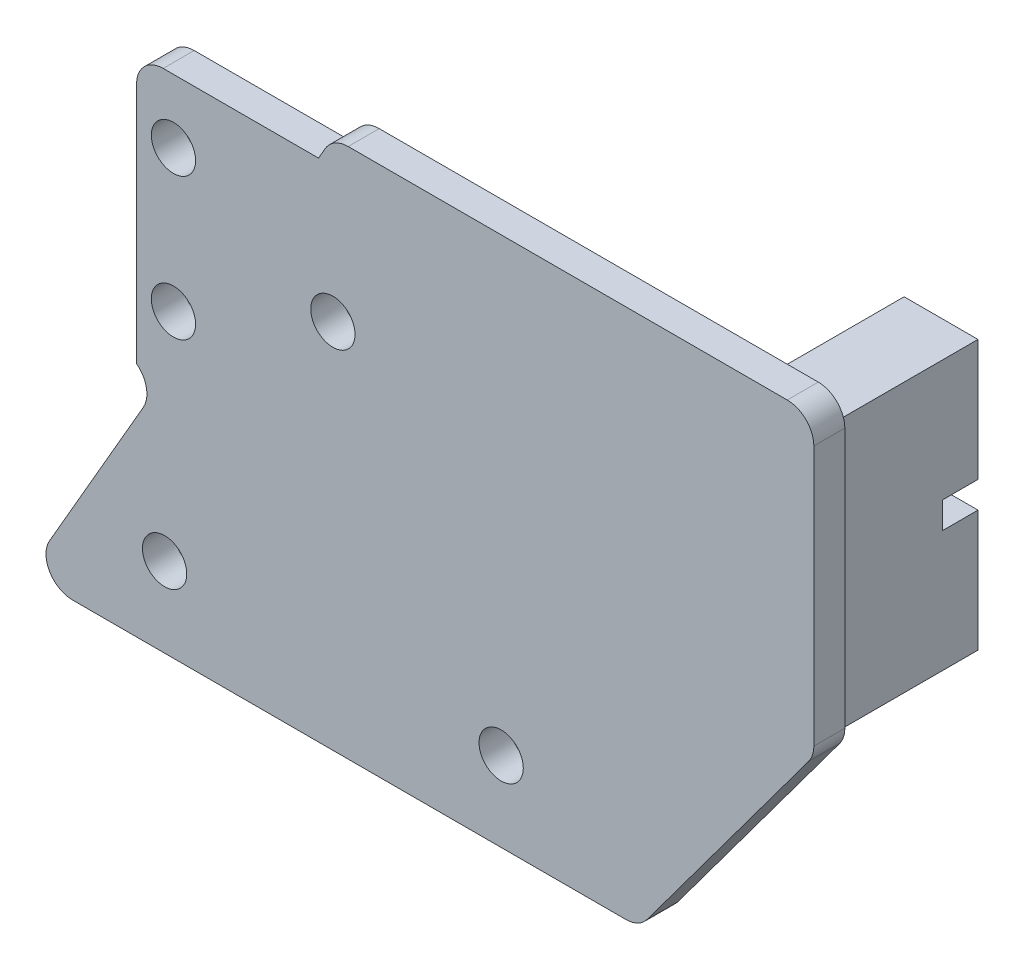
ISO-10303-21;
HEADER;
FILE_DESCRIPTION(('STEP AP214'),'2;1');
FILE_NAME('part.step','',(''),(''),'','','');
FILE_SCHEMA(('AUTOMOTIVE_DESIGN { 1 0 10303 214 1 1 1 1 }'));
ENDSEC;
DATA;
#1=APPLICATION_CONTEXT('core data for automotive mechanical design processes');
#2=APPLICATION_PROTOCOL_DEFINITION('international standard','automotive_design',2000,#1);
#3=PRODUCT_CONTEXT('',#1,'mechanical');
#4=PRODUCT('Part','Part','',(#3));
#5=PRODUCT_RELATED_PRODUCT_CATEGORY('part','',(#4));
#6=PRODUCT_DEFINITION_FORMATION('','',#4);
#7=PRODUCT_DEFINITION_CONTEXT('part definition',#1,'design');
#8=PRODUCT_DEFINITION('design','',#6,#7);
#9=PRODUCT_DEFINITION_SHAPE('','',#8);
#10=(LENGTH_UNIT() NAMED_UNIT(*) SI_UNIT(.MILLI.,.METRE.));
#11=(NAMED_UNIT(*) PLANE_ANGLE_UNIT() SI_UNIT($,.RADIAN.));
#12=(NAMED_UNIT(*) SI_UNIT($,.STERADIAN.) SOLID_ANGLE_UNIT());
#13=UNCERTAINTY_MEASURE_WITH_UNIT(LENGTH_MEASURE(1.E-05),#10,'distance_accuracy_value','');
#14=(GEOMETRIC_REPRESENTATION_CONTEXT(3) GLOBAL_UNCERTAINTY_ASSIGNED_CONTEXT((#13)) GLOBAL_UNIT_ASSIGNED_CONTEXT((#10,
#11,#12)) REPRESENTATION_CONTEXT('',''));
#15=CARTESIAN_POINT('',(0.,0.,0.));
#16=DIRECTION('',(0.,0.,1.));
#17=DIRECTION('',(1.,0.,0.));
#18=AXIS2_PLACEMENT_3D('',#15,#16,#17);
#19=CARTESIAN_POINT('',(1.83151861228162,50.9089653438087,3.5));
#20=DIRECTION('',(0.866025403784439,-0.5,0.));
#21=DIRECTION('',(0.5,0.866025403784439,0.));
#22=AXIS2_PLACEMENT_3D('',#19,#20,#21);
#23=PLANE('',#22);
#24=DIRECTION('',(0.,0.,-1.));
#25=VECTOR('',#24,1.);
#26=CARTESIAN_POINT('',(0.209745448121847,48.0999718251322,3.5));
#27=LINE('',#26,#25);
#28=CARTESIAN_POINT('',(0.209745448121847,48.0999718251322,3.5));
#29=VERTEX_POINT('',#28);
#30=CARTESIAN_POINT('',(0.209745448121847,48.0999718251322,0.));
#31=VERTEX_POINT('',#30);
#32=EDGE_CURVE('E407',#29,#31,#27,.T.);
#33=ORIENTED_EDGE('',*,*,#32,.F.);
#34=DIRECTION('',(-0.5,-0.866025403784439,0.));
#35=VECTOR('',#34,1.);
#36=CARTESIAN_POINT('',(1.83151861228162,50.9089653438087,3.5));
#37=LINE('',#36,#35);
#38=CARTESIAN_POINT('',(0.965493208497183,49.4089653438087,3.5));
#39=VERTEX_POINT('',#38);
#40=EDGE_CURVE('E353',#39,#29,#37,.T.);
#41=ORIENTED_EDGE('',*,*,#40,.F.);
#42=DIRECTION('',(0.,0.,-1.));
#43=VECTOR('',#42,1.);
#44=CARTESIAN_POINT('',(0.965493208497183,49.4089653438087,3.5));
#45=LINE('',#44,#43);
#46=CARTESIAN_POINT('',(0.965493208497183,49.4089653438087,0.));
#47=VERTEX_POINT('',#46);
#48=EDGE_CURVE('E379',#39,#47,#45,.T.);
#49=ORIENTED_EDGE('',*,*,#48,.T.);
#50=DIRECTION('',(-0.5,-0.866025403784439,0.));
#51=VECTOR('',#50,1.);
#52=CARTESIAN_POINT('',(1.83151861228162,50.9089653438087,0.));
#53=LINE('',#52,#51);
#54=EDGE_CURVE('E367',#47,#31,#53,.T.);
#55=ORIENTED_EDGE('',*,*,#54,.T.);
#56=EDGE_LOOP('',(#33,#41,#49,#55));
#57=FACE_BOUND('',#56,.T.);
#58=ADVANCED_FACE('F112',(#57),#23,.F.);
#59=CARTESIAN_POINT('',(0.,0.,3.5));
#60=DIRECTION('',(0.,0.,-1.));
#61=DIRECTION('',(-1.,0.,0.));
#62=AXIS2_PLACEMENT_3D('',#59,#60,#61);
#63=PLANE('',#62);
#64=DIRECTION('',(0.595899203511858,0.803059237699146,0.));
#65=VECTOR('',#64,1.);
#66=CARTESIAN_POINT('',(36.4199758804015,-9.,3.5));
#67=LINE('',#66,#65);
#68=CARTESIAN_POINT('',(37.3195484080362,-7.78769761053558,3.5));
#69=VERTEX_POINT('',#68);
#70=CARTESIAN_POINT('',(55.5457579816746,16.7747214698915,3.5));
#71=VERTEX_POINT('',#70);
#72=EDGE_CURVE('E359',#69,#71,#67,.T.);
#73=ORIENTED_EDGE('',*,*,#72,.T.);
#74=CARTESIAN_POINT('',(53.1365802685772,18.5624190804271,3.5));
#75=DIRECTION('',(0.,0.,-1.));
#76=DIRECTION('',(-1.,0.,0.));
#77=AXIS2_PLACEMENT_3D('',#74,#75,#76);
#78=CIRCLE('',#77,3.);
#79=CARTESIAN_POINT('',(56.1365802685772,18.5624190804271,3.5));
#80=VERTEX_POINT('',#79);
#81=EDGE_CURVE('E439',#71,#80,#78,.F.);
#82=ORIENTED_EDGE('',*,*,#81,.T.);
#83=DIRECTION('',(0.,1.,0.));
#84=VECTOR('',#83,1.);
#85=CARTESIAN_POINT('',(56.1365802685772,17.5709388377608,3.5));
#86=LINE('',#85,#84);
#87=CARTESIAN_POINT('',(56.1365802685772,47.9089653438087,3.5));
#88=VERTEX_POINT('',#87);
#89=EDGE_CURVE('E362',#80,#88,#86,.T.);
#90=ORIENTED_EDGE('',*,*,#89,.T.);
#91=CARTESIAN_POINT('',(53.1365802685772,47.9089653438087,3.5));
#92=DIRECTION('',(0.,0.,-1.));
#93=DIRECTION('',(-1.,0.,0.));
#94=AXIS2_PLACEMENT_3D('',#91,#92,#93);
#95=CIRCLE('',#94,3.);
#96=CARTESIAN_POINT('',(53.1365802685772,50.9089653438087,3.5));
#97=VERTEX_POINT('',#96);
#98=EDGE_CURVE('E127',#88,#97,#95,.F.);
#99=ORIENTED_EDGE('',*,*,#98,.T.);
#100=DIRECTION('',(-1.,0.,0.));
#101=VECTOR('',#100,1.);
#102=CARTESIAN_POINT('',(56.1365802685772,50.9089653438087,3.5));
#103=LINE('',#102,#101);
#104=CARTESIAN_POINT('',(3.5635694198505,50.9089653438087,3.5));
#105=VERTEX_POINT('',#104);
#106=EDGE_CURVE('E349',#97,#105,#103,.T.);
#107=ORIENTED_EDGE('',*,*,#106,.T.);
#108=CARTESIAN_POINT('',(3.5635694198505,47.9089653438087,3.5));
#109=DIRECTION('',(0.,0.,-1.));
#110=DIRECTION('',(-1.,0.,0.));
#111=AXIS2_PLACEMENT_3D('',#108,#109,#110);
#112=CIRCLE('',#111,3.);
#113=EDGE_CURVE('E397',#105,#39,#112,.F.);
#114=ORIENTED_EDGE('',*,*,#113,.T.);
#115=ORIENTED_EDGE('',*,*,#40,.T.);
#116=DIRECTION('',(-1.,0.,0.));
#117=VECTOR('',#116,1.);
#118=CARTESIAN_POINT('',(55.1718698455063,48.0999718251322,3.5));
#119=LINE('',#118,#117);
#120=CARTESIAN_POINT('',(-17.3281301544937,48.0999718251322,3.5));
#121=VERTEX_POINT('',#120);
#122=EDGE_CURVE('E321',#29,#121,#119,.T.);
#123=ORIENTED_EDGE('',*,*,#122,.T.);
#124=CARTESIAN_POINT('',(-17.3281301544937,45.0999718251322,3.5));
#125=DIRECTION('',(0.,0.,-1.));
#126=DIRECTION('',(-1.,0.,0.));
#127=AXIS2_PLACEMENT_3D('',#124,#125,#126);
#128=CIRCLE('',#127,3.);
#129=CARTESIAN_POINT('',(-20.3281301544937,45.0999718251322,3.5));
#130=VERTEX_POINT('',#129);
#131=EDGE_CURVE('E134',#121,#130,#128,.F.);
#132=ORIENTED_EDGE('',*,*,#131,.T.);
#133=DIRECTION('',(0.,-1.,0.));
#134=VECTOR('',#133,1.);
#135=CARTESIAN_POINT('',(-20.3281301544937,48.0999718251322,3.5));
#136=LINE('',#135,#134);
#137=CARTESIAN_POINT('',(-20.3281301544937,17.7179588624851,3.5));
#138=VERTEX_POINT('',#137);
#139=EDGE_CURVE('E319',#130,#138,#136,.T.);
#140=ORIENTED_EDGE('',*,*,#139,.T.);
#141=CARTESIAN_POINT('',(-22.1648870700066,15.345971503051,3.5));
#142=DIRECTION('',(0.,0.,-1.));
#143=DIRECTION('',(-1.,0.,0.));
#144=AXIS2_PLACEMENT_3D('',#141,#142,#143);
#145=CIRCLE('',#144,3.);
#146=CARTESIAN_POINT('',(-19.5668108586533,13.845971503051,3.5));
#147=VERTEX_POINT('',#146);
#148=EDGE_CURVE('E422',#138,#147,#145,.T.);
#149=ORIENTED_EDGE('',*,*,#148,.T.);
#150=CARTESIAN_POINT('',(-30.158862444485,-4.50000000000001,3.5));
#151=VERTEX_POINT('',#150);
#152=EDGE_CURVE('E351',#147,#151,#37,.T.);
#153=ORIENTED_EDGE('',*,*,#152,.T.);
#154=CARTESIAN_POINT('',(-27.5607862331316,-6.00000000000001,3.5));
#155=DIRECTION('',(0.,0.,-1.));
#156=DIRECTION('',(-1.,0.,0.));
#157=AXIS2_PLACEMENT_3D('',#154,#155,#156);
#158=CIRCLE('',#157,3.);
#159=CARTESIAN_POINT('',(-27.5607862331316,-9.00000000000001,3.5));
#160=VERTEX_POINT('',#159);
#161=EDGE_CURVE('E393',#151,#160,#158,.F.);
#162=ORIENTED_EDGE('',*,*,#161,.T.);
#163=DIRECTION('',(1.,0.,0.));
#164=VECTOR('',#163,1.);
#165=CARTESIAN_POINT('',(-32.7569386558383,-9.00000000000001,3.5));
#166=LINE('',#165,#164);
#167=CARTESIAN_POINT('',(34.9103706949387,-9.,3.5));
#168=VERTEX_POINT('',#167);
#169=EDGE_CURVE('E356',#160,#168,#166,.T.);
#170=ORIENTED_EDGE('',*,*,#169,.T.);
#171=CARTESIAN_POINT('',(34.9103706949387,-6.,3.5));
#172=DIRECTION('',(0.,0.,-1.));
#173=DIRECTION('',(-1.,0.,0.));
#174=AXIS2_PLACEMENT_3D('',#171,#172,#173);
#175=CIRCLE('',#174,3.);
#176=EDGE_CURVE('E395',#168,#69,#175,.F.);
#177=ORIENTED_EDGE('',*,*,#176,.T.);
#178=EDGE_LOOP('',(#73,#82,#90,#99,#107,#114,#115,#123,#132,#140,#149,#153,#162,#170,#177));
#179=FACE_BOUND('',#178,.T.);
#180=CARTESIAN_POINT('',(-16.1684813877184,24.9089653438087,3.5));
#181=DIRECTION('',(0.,0.,-1.));
#182=DIRECTION('',(-1.,0.,0.));
#183=AXIS2_PLACEMENT_3D('',#180,#181,#182);
#184=CIRCLE('',#183,2.5);
#185=CARTESIAN_POINT('',(-18.6684813877184,24.9089653438087,3.5));
#186=VERTEX_POINT('',#185);
#187=EDGE_CURVE('E313',#186,#186,#184,.T.);
#188=ORIENTED_EDGE('',*,*,#187,.T.);
#189=EDGE_LOOP('',(#188));
#190=FACE_BOUND('',#189,.T.);
#191=CARTESIAN_POINT('',(-16.1684813877184,40.9089653438087,3.5));
#192=DIRECTION('',(0.,0.,-1.));
#193=DIRECTION('',(-1.,0.,0.));
#194=AXIS2_PLACEMENT_3D('',#191,#192,#193);
#195=CIRCLE('',#194,2.5);
#196=CARTESIAN_POINT('',(-18.6684813877184,40.9089653438087,3.5));
#197=VERTEX_POINT('',#196);
#198=EDGE_CURVE('E307',#197,#197,#195,.T.);
#199=ORIENTED_EDGE('',*,*,#198,.T.);
#200=EDGE_LOOP('',(#199));
#201=FACE_BOUND('',#200,.T.);
#202=CARTESIAN_POINT('',(1.83151861228162,32.9089653438087,3.5));
#203=DIRECTION('',(0.,0.,1.));
#204=DIRECTION('',(1.,0.,0.));
#205=AXIS2_PLACEMENT_3D('',#202,#203,#204);
#206=CIRCLE('',#205,2.5);
#207=CARTESIAN_POINT('',(4.33151861228162,32.9089653438087,3.5));
#208=VERTEX_POINT('',#207);
#209=EDGE_CURVE('E331',#208,#208,#206,.T.);
#210=ORIENTED_EDGE('',*,*,#209,.F.);
#211=EDGE_LOOP('',(#210));
#212=FACE_BOUND('',#211,.T.);
#213=CARTESIAN_POINT('',(20.8315186122816,0.,3.5));
#214=DIRECTION('',(0.,0.,1.));
#215=DIRECTION('',(1.,0.,0.));
#216=AXIS2_PLACEMENT_3D('',#213,#214,#215);
#217=CIRCLE('',#216,2.5);
#218=CARTESIAN_POINT('',(23.3315186122816,0.,3.5));
#219=VERTEX_POINT('',#218);
#220=EDGE_CURVE('E337',#219,#219,#217,.T.);
#221=ORIENTED_EDGE('',*,*,#220,.F.);
#222=EDGE_LOOP('',(#221));
#223=FACE_BOUND('',#222,.T.);
#224=CARTESIAN_POINT('',(-17.1684813877184,0.,3.5));
#225=DIRECTION('',(0.,0.,1.));
#226=DIRECTION('',(1.,0.,0.));
#227=AXIS2_PLACEMENT_3D('',#224,#225,#226);
#228=CIRCLE('',#227,2.5);
#229=CARTESIAN_POINT('',(-14.6684813877184,0.,3.5));
#230=VERTEX_POINT('',#229);
#231=EDGE_CURVE('E343',#230,#230,#228,.T.);
#232=ORIENTED_EDGE('',*,*,#231,.F.);
#233=EDGE_LOOP('',(#232));
#234=FACE_BOUND('',#233,.T.);
#235=ADVANCED_FACE('F461',(#179,#190,#201,#212,#223,#234),#63,.F.);
#236=CARTESIAN_POINT('',(0.,0.,0.));
#237=DIRECTION('',(0.,0.,-1.));
#238=DIRECTION('',(-1.,0.,0.));
#239=AXIS2_PLACEMENT_3D('',#236,#237,#238);
#240=PLANE('',#239);
#241=DIRECTION('',(0.,-1.,0.));
#242=VECTOR('',#241,1.);
#243=CARTESIAN_POINT('',(46.8315186122816,0.,0.));
#244=LINE('',#243,#242);
#245=CARTESIAN_POINT('',(46.8315186122816,48.0999718251322,0.));
#246=VERTEX_POINT('',#245);
#247=CARTESIAN_POINT('',(46.8315186122816,17.7179588624851,0.));
#248=VERTEX_POINT('',#247);
#249=EDGE_CURVE('E898',#246,#248,#244,.T.);
#250=ORIENTED_EDGE('',*,*,#249,.T.);
#251=DIRECTION('',(-1.,0.,0.));
#252=VECTOR('',#251,1.);
#253=CARTESIAN_POINT('',(0.,17.7179588624851,0.));
#254=LINE('',#253,#252);
#255=CARTESIAN_POINT('',(55.1718698455063,17.7179588624851,0.));
#256=VERTEX_POINT('',#255);
#257=EDGE_CURVE('E279',#256,#248,#254,.T.);
#258=ORIENTED_EDGE('',*,*,#257,.F.);
#259=DIRECTION('',(0.,-1.,0.));
#260=VECTOR('',#259,1.);
#261=CARTESIAN_POINT('',(55.1718698455063,0.,0.));
#262=LINE('',#261,#260);
#263=CARTESIAN_POINT('',(55.1718698455063,48.0999718251322,0.));
#264=VERTEX_POINT('',#263);
#265=EDGE_CURVE('E300',#264,#256,#262,.T.);
#266=ORIENTED_EDGE('',*,*,#265,.F.);
#267=DIRECTION('',(-1.,0.,0.));
#268=VECTOR('',#267,1.);
#269=CARTESIAN_POINT('',(0.,48.0999718251322,0.));
#270=LINE('',#269,#268);
#271=EDGE_CURVE('E899',#264,#246,#270,.T.);
#272=ORIENTED_EDGE('',*,*,#271,.T.);
#273=EDGE_LOOP('',(#250,#258,#266,#272));
#274=FACE_BOUND('',#273,.T.);
#275=DIRECTION('',(0.,1.,0.));
#276=VECTOR('',#275,1.);
#277=CARTESIAN_POINT('',(56.1365802685772,17.5709388377608,0.));
#278=LINE('',#277,#276);
#279=CARTESIAN_POINT('',(56.1365802685772,18.5624190804271,0.));
#280=VERTEX_POINT('',#279);
#281=CARTESIAN_POINT('',(56.1365802685772,47.9089653438087,0.));
#282=VERTEX_POINT('',#281);
#283=EDGE_CURVE('E352',#280,#282,#278,.T.);
#284=ORIENTED_EDGE('',*,*,#283,.F.);
#285=CARTESIAN_POINT('',(53.1365802685772,18.5624190804271,0.));
#286=DIRECTION('',(0.,0.,-1.));
#287=DIRECTION('',(-1.,0.,0.));
#288=AXIS2_PLACEMENT_3D('',#285,#286,#287);
#289=CIRCLE('',#288,3.);
#290=CARTESIAN_POINT('',(55.5457579816746,16.7747214698915,0.));
#291=VERTEX_POINT('',#290);
#292=EDGE_CURVE('E433',#280,#291,#289,.T.);
#293=ORIENTED_EDGE('',*,*,#292,.T.);
#294=DIRECTION('',(0.595899203511858,0.803059237699146,0.));
#295=VECTOR('',#294,1.);
#296=CARTESIAN_POINT('',(36.4199758804015,-9.,0.));
#297=LINE('',#296,#295);
#298=CARTESIAN_POINT('',(37.3195484080362,-7.78769761053558,0.));
#299=VERTEX_POINT('',#298);
#300=EDGE_CURVE('E372',#299,#291,#297,.T.);
#301=ORIENTED_EDGE('',*,*,#300,.F.);
#302=CARTESIAN_POINT('',(34.9103706949387,-6.,0.));
#303=DIRECTION('',(0.,0.,-1.));
#304=DIRECTION('',(-1.,0.,0.));
#305=AXIS2_PLACEMENT_3D('',#302,#303,#304);
#306=CIRCLE('',#305,3.);
#307=CARTESIAN_POINT('',(34.9103706949387,-9.,0.));
#308=VERTEX_POINT('',#307);
#309=EDGE_CURVE('E385',#299,#308,#306,.T.);
#310=ORIENTED_EDGE('',*,*,#309,.T.);
#311=DIRECTION('',(1.,0.,0.));
#312=VECTOR('',#311,1.);
#313=CARTESIAN_POINT('',(-32.7569386558383,-9.00000000000001,0.));
#314=LINE('',#313,#312);
#315=CARTESIAN_POINT('',(-27.5607862331316,-9.00000000000001,0.));
#316=VERTEX_POINT('',#315);
#317=EDGE_CURVE('E369',#316,#308,#314,.T.);
#318=ORIENTED_EDGE('',*,*,#317,.F.);
#319=CARTESIAN_POINT('',(-27.5607862331316,-6.00000000000001,0.));
#320=DIRECTION('',(0.,0.,-1.));
#321=DIRECTION('',(-1.,0.,0.));
#322=AXIS2_PLACEMENT_3D('',#319,#320,#321);
#323=CIRCLE('',#322,3.);
#324=CARTESIAN_POINT('',(-30.158862444485,-4.50000000000001,0.));
#325=VERTEX_POINT('',#324);
#326=EDGE_CURVE('E382',#316,#325,#323,.T.);
#327=ORIENTED_EDGE('',*,*,#326,.T.);
#328=CARTESIAN_POINT('',(-19.5668108586533,13.845971503051,0.));
#329=VERTEX_POINT('',#328);
#330=EDGE_CURVE('E366',#329,#325,#53,.T.);
#331=ORIENTED_EDGE('',*,*,#330,.F.);
#332=CARTESIAN_POINT('',(-22.1648870700066,15.345971503051,0.));
#333=DIRECTION('',(0.,0.,-1.));
#334=DIRECTION('',(-1.,0.,0.));
#335=AXIS2_PLACEMENT_3D('',#332,#333,#334);
#336=CIRCLE('',#335,3.);
#337=CARTESIAN_POINT('',(-20.3281301544937,17.7179588624851,0.));
#338=VERTEX_POINT('',#337);
#339=EDGE_CURVE('E419',#329,#338,#336,.F.);
#340=ORIENTED_EDGE('',*,*,#339,.T.);
#341=DIRECTION('',(0.,-1.,0.));
#342=VECTOR('',#341,1.);
#343=CARTESIAN_POINT('',(-20.3281301544937,48.0999718251322,0.));
#344=LINE('',#343,#342);
#345=CARTESIAN_POINT('',(-20.3281301544937,45.0999718251322,0.));
#346=VERTEX_POINT('',#345);
#347=EDGE_CURVE('E316',#346,#338,#344,.T.);
#348=ORIENTED_EDGE('',*,*,#347,.F.);
#349=CARTESIAN_POINT('',(-17.3281301544937,45.0999718251322,0.));
#350=DIRECTION('',(0.,0.,-1.));
#351=DIRECTION('',(-1.,0.,0.));
#352=AXIS2_PLACEMENT_3D('',#349,#350,#351);
#353=CIRCLE('',#352,3.);
#354=CARTESIAN_POINT('',(-17.3281301544937,48.0999718251322,0.));
#355=VERTEX_POINT('',#354);
#356=EDGE_CURVE('E429',#346,#355,#353,.T.);
#357=ORIENTED_EDGE('',*,*,#356,.T.);
#358=DIRECTION('',(-1.,0.,0.));
#359=VECTOR('',#358,1.);
#360=CARTESIAN_POINT('',(55.1718698455063,48.0999718251322,0.));
#361=LINE('',#360,#359);
#362=EDGE_CURVE('E322',#31,#355,#361,.T.);
#363=ORIENTED_EDGE('',*,*,#362,.F.);
#364=ORIENTED_EDGE('',*,*,#54,.F.);
#365=CARTESIAN_POINT('',(3.5635694198505,47.9089653438087,0.));
#366=DIRECTION('',(0.,0.,-1.));
#367=DIRECTION('',(-1.,0.,0.));
#368=AXIS2_PLACEMENT_3D('',#365,#366,#367);
#369=CIRCLE('',#368,3.);
#370=CARTESIAN_POINT('',(3.5635694198505,50.9089653438087,0.));
#371=VERTEX_POINT('',#370);
#372=EDGE_CURVE('E387',#47,#371,#369,.T.);
#373=ORIENTED_EDGE('',*,*,#372,.T.);
#374=DIRECTION('',(-1.,0.,0.));
#375=VECTOR('',#374,1.);
#376=CARTESIAN_POINT('',(56.1365802685772,50.9089653438087,0.));
#377=LINE('',#376,#375);
#378=CARTESIAN_POINT('',(53.1365802685772,50.9089653438087,0.));
#379=VERTEX_POINT('',#378);
#380=EDGE_CURVE('E346',#379,#371,#377,.T.);
#381=ORIENTED_EDGE('',*,*,#380,.F.);
#382=CARTESIAN_POINT('',(53.1365802685772,47.9089653438087,0.));
#383=DIRECTION('',(0.,0.,-1.));
#384=DIRECTION('',(-1.,0.,0.));
#385=AXIS2_PLACEMENT_3D('',#382,#383,#384);
#386=CIRCLE('',#385,3.);
#387=EDGE_CURVE('E431',#379,#282,#386,.T.);
#388=ORIENTED_EDGE('',*,*,#387,.T.);
#389=EDGE_LOOP('',(#284,#293,#301,#310,#318,#327,#331,#340,#348,#357,#363,#364,#373,#381,#388));
#390=FACE_BOUND('',#389,.T.);
#391=CARTESIAN_POINT('',(-16.1684813877184,24.9089653438087,0.));
#392=DIRECTION('',(0.,0.,-1.));
#393=DIRECTION('',(-1.,0.,0.));
#394=AXIS2_PLACEMENT_3D('',#391,#392,#393);
#395=CIRCLE('',#394,2.5);
#396=CARTESIAN_POINT('',(-18.6684813877184,24.9089653438087,0.));
#397=VERTEX_POINT('',#396);
#398=EDGE_CURVE('E310',#397,#397,#395,.T.);
#399=ORIENTED_EDGE('',*,*,#398,.F.);
#400=EDGE_LOOP('',(#399));
#401=FACE_BOUND('',#400,.T.);
#402=CARTESIAN_POINT('',(-16.1684813877184,40.9089653438087,0.));
#403=DIRECTION('',(0.,0.,-1.));
#404=DIRECTION('',(-1.,0.,0.));
#405=AXIS2_PLACEMENT_3D('',#402,#403,#404);
#406=CIRCLE('',#405,2.5);
#407=CARTESIAN_POINT('',(-18.6684813877184,40.9089653438087,0.));
#408=VERTEX_POINT('',#407);
#409=EDGE_CURVE('E306',#408,#408,#406,.T.);
#410=ORIENTED_EDGE('',*,*,#409,.F.);
#411=EDGE_LOOP('',(#410));
#412=FACE_BOUND('',#411,.T.);
#413=CARTESIAN_POINT('',(1.83151861228162,32.9089653438087,0.));
#414=DIRECTION('',(0.,0.,1.));
#415=DIRECTION('',(1.,0.,0.));
#416=AXIS2_PLACEMENT_3D('',#413,#414,#415);
#417=CIRCLE('',#416,2.5);
#418=CARTESIAN_POINT('',(4.33151861228162,32.9089653438087,0.));
#419=VERTEX_POINT('',#418);
#420=EDGE_CURVE('E330',#419,#419,#417,.T.);
#421=ORIENTED_EDGE('',*,*,#420,.T.);
#422=EDGE_LOOP('',(#421));
#423=FACE_BOUND('',#422,.T.);
#424=CARTESIAN_POINT('',(-17.1684813877184,0.,0.));
#425=DIRECTION('',(0.,0.,1.));
#426=DIRECTION('',(1.,0.,0.));
#427=AXIS2_PLACEMENT_3D('',#424,#425,#426);
#428=CIRCLE('',#427,2.5);
#429=CARTESIAN_POINT('',(-14.6684813877184,0.,0.));
#430=VERTEX_POINT('',#429);
#431=EDGE_CURVE('E340',#430,#430,#428,.T.);
#432=ORIENTED_EDGE('',*,*,#431,.T.);
#433=EDGE_LOOP('',(#432));
#434=FACE_BOUND('',#433,.T.);
#435=CARTESIAN_POINT('',(20.8315186122816,0.,0.));
#436=DIRECTION('',(0.,0.,1.));
#437=DIRECTION('',(1.,0.,0.));
#438=AXIS2_PLACEMENT_3D('',#435,#436,#437);
#439=CIRCLE('',#438,2.5);
#440=CARTESIAN_POINT('',(23.3315186122816,0.,0.));
#441=VERTEX_POINT('',#440);
#442=EDGE_CURVE('E334',#441,#441,#439,.T.);
#443=ORIENTED_EDGE('',*,*,#442,.T.);
#444=EDGE_LOOP('',(#443));
#445=FACE_BOUND('',#444,.T.);
#446=ADVANCED_FACE('F452',(#274,#390,#401,#412,#423,#434,#445),#240,.T.);
#447=CARTESIAN_POINT('',(56.1365802685772,50.9089653438087,3.5));
#448=DIRECTION('',(0.,-1.,0.));
#449=DIRECTION('',(0.,0.,-1.));
#450=AXIS2_PLACEMENT_3D('',#447,#448,#449);
#451=PLANE('',#450);
#452=ORIENTED_EDGE('',*,*,#106,.F.);
#453=DIRECTION('',(0.,0.,-1.));
#454=VECTOR('',#453,1.);
#455=CARTESIAN_POINT('',(53.1365802685772,50.9089653438087,3.5));
#456=LINE('',#455,#454);
#457=EDGE_CURVE('E441',#97,#379,#456,.T.);
#458=ORIENTED_EDGE('',*,*,#457,.T.);
#459=ORIENTED_EDGE('',*,*,#380,.T.);
#460=DIRECTION('',(0.,0.,-1.));
#461=VECTOR('',#460,1.);
#462=CARTESIAN_POINT('',(3.5635694198505,50.9089653438087,3.5));
#463=LINE('',#462,#461);
#464=EDGE_CURVE('E390',#371,#105,#463,.F.);
#465=ORIENTED_EDGE('',*,*,#464,.T.);
#466=EDGE_LOOP('',(#452,#458,#459,#465));
#467=FACE_BOUND('',#466,.T.);
#468=ADVANCED_FACE('F497',(#467),#451,.F.);
#469=ORIENTED_EDGE('',*,*,#152,.F.);
#470=DIRECTION('',(0.,0.,1.));
#471=VECTOR('',#470,1.);
#472=CARTESIAN_POINT('',(-19.5668108586533,13.845971503051,3.5));
#473=LINE('',#472,#471);
#474=EDGE_CURVE('E416',#147,#329,#473,.F.);
#475=ORIENTED_EDGE('',*,*,#474,.T.);
#476=ORIENTED_EDGE('',*,*,#330,.T.);
#477=DIRECTION('',(0.,0.,-1.));
#478=VECTOR('',#477,1.);
#479=CARTESIAN_POINT('',(-30.158862444485,-4.50000000000001,3.5));
#480=LINE('',#479,#478);
#481=EDGE_CURVE('E364',#325,#151,#480,.F.);
#482=ORIENTED_EDGE('',*,*,#481,.T.);
#483=EDGE_LOOP('',(#469,#475,#476,#482));
#484=FACE_BOUND('',#483,.T.);
#485=ADVANCED_FACE('F464',(#484),#23,.F.);
#486=CARTESIAN_POINT('',(-32.7569386558383,-9.00000000000001,3.5));
#487=DIRECTION('',(0.,1.,0.));
#488=DIRECTION('',(-1.,0.,0.));
#489=AXIS2_PLACEMENT_3D('',#486,#487,#488);
#490=PLANE('',#489);
#491=ORIENTED_EDGE('',*,*,#317,.T.);
#492=DIRECTION('',(0.,0.,-1.));
#493=VECTOR('',#492,1.);
#494=CARTESIAN_POINT('',(34.9103706949387,-9.,3.5));
#495=LINE('',#494,#493);
#496=EDGE_CURVE('E405',#308,#168,#495,.F.);
#497=ORIENTED_EDGE('',*,*,#496,.T.);
#498=ORIENTED_EDGE('',*,*,#169,.F.);
#499=DIRECTION('',(0.,0.,-1.));
#500=VECTOR('',#499,1.);
#501=CARTESIAN_POINT('',(-27.5607862331316,-9.00000000000001,3.5));
#502=LINE('',#501,#500);
#503=EDGE_CURVE('E402',#160,#316,#502,.T.);
#504=ORIENTED_EDGE('',*,*,#503,.T.);
#505=EDGE_LOOP('',(#491,#497,#498,#504));
#506=FACE_BOUND('',#505,.T.);
#507=ADVANCED_FACE('F473',(#506),#490,.F.);
#508=CARTESIAN_POINT('',(36.4199758804015,-9.,3.5));
#509=DIRECTION('',(-0.803059237699146,0.595899203511858,0.));
#510=DIRECTION('',(-0.595899203511858,-0.803059237699146,0.));
#511=AXIS2_PLACEMENT_3D('',#508,#509,#510);
#512=PLANE('',#511);
#513=ORIENTED_EDGE('',*,*,#300,.T.);
#514=DIRECTION('',(0.,0.,-1.));
#515=VECTOR('',#514,1.);
#516=CARTESIAN_POINT('',(55.5457579816746,16.7747214698915,3.5));
#517=LINE('',#516,#515);
#518=EDGE_CURVE('E435',#291,#71,#517,.F.);
#519=ORIENTED_EDGE('',*,*,#518,.T.);
#520=ORIENTED_EDGE('',*,*,#72,.F.);
#521=DIRECTION('',(0.,0.,-1.));
#522=VECTOR('',#521,1.);
#523=CARTESIAN_POINT('',(37.3195484080362,-7.78769761053558,3.5));
#524=LINE('',#523,#522);
#525=EDGE_CURVE('E399',#69,#299,#524,.T.);
#526=ORIENTED_EDGE('',*,*,#525,.T.);
#527=EDGE_LOOP('',(#513,#519,#520,#526));
#528=FACE_BOUND('',#527,.T.);
#529=ADVANCED_FACE('F482',(#528),#512,.F.);
#530=CARTESIAN_POINT('',(56.1365802685772,17.5709388377608,3.5));
#531=DIRECTION('',(-1.,0.,0.));
#532=DIRECTION('',(0.,0.,1.));
#533=AXIS2_PLACEMENT_3D('',#530,#531,#532);
#534=PLANE('',#533);
#535=ORIENTED_EDGE('',*,*,#89,.F.);
#536=DIRECTION('',(0.,0.,-1.));
#537=VECTOR('',#536,1.);
#538=CARTESIAN_POINT('',(56.1365802685772,18.5624190804271,3.5));
#539=LINE('',#538,#537);
#540=EDGE_CURVE('E426',#80,#280,#539,.T.);
#541=ORIENTED_EDGE('',*,*,#540,.T.);
#542=ORIENTED_EDGE('',*,*,#283,.T.);
#543=DIRECTION('',(0.,0.,-1.));
#544=VECTOR('',#543,1.);
#545=CARTESIAN_POINT('',(56.1365802685772,47.9089653438087,3.5));
#546=LINE('',#545,#544);
#547=EDGE_CURVE('E424',#282,#88,#546,.F.);
#548=ORIENTED_EDGE('',*,*,#547,.T.);
#549=EDGE_LOOP('',(#535,#541,#542,#548));
#550=FACE_BOUND('',#549,.T.);
#551=ADVANCED_FACE('F490',(#550),#534,.F.);
#552=CARTESIAN_POINT('',(-17.1684813877184,0.,3.5));
#553=DIRECTION('',(0.,0.,-1.));
#554=DIRECTION('',(-1.,0.,0.));
#555=AXIS2_PLACEMENT_3D('',#552,#553,#554);
#556=CYLINDRICAL_SURFACE('',#555,2.5);
#557=ORIENTED_EDGE('',*,*,#231,.T.);
#558=EDGE_LOOP('',(#557));
#559=FACE_BOUND('',#558,.T.);
#560=ORIENTED_EDGE('',*,*,#431,.F.);
#561=EDGE_LOOP('',(#560));
#562=FACE_BOUND('',#561,.T.);
#563=ADVANCED_FACE('F697',(#559,#562),#556,.F.);
#564=CARTESIAN_POINT('',(20.8315186122816,0.,3.5));
#565=DIRECTION('',(0.,0.,-1.));
#566=DIRECTION('',(-1.,0.,0.));
#567=AXIS2_PLACEMENT_3D('',#564,#565,#566);
#568=CYLINDRICAL_SURFACE('',#567,2.5);
#569=ORIENTED_EDGE('',*,*,#220,.T.);
#570=EDGE_LOOP('',(#569));
#571=FACE_BOUND('',#570,.T.);
#572=ORIENTED_EDGE('',*,*,#442,.F.);
#573=EDGE_LOOP('',(#572));
#574=FACE_BOUND('',#573,.T.);
#575=ADVANCED_FACE('F788',(#571,#574),#568,.F.);
#576=CARTESIAN_POINT('',(1.83151861228162,32.9089653438087,3.5));
#577=DIRECTION('',(0.,0.,-1.));
#578=DIRECTION('',(-1.,0.,0.));
#579=AXIS2_PLACEMENT_3D('',#576,#577,#578);
#580=CYLINDRICAL_SURFACE('',#579,2.5);
#581=ORIENTED_EDGE('',*,*,#209,.T.);
#582=EDGE_LOOP('',(#581));
#583=FACE_BOUND('',#582,.T.);
#584=ORIENTED_EDGE('',*,*,#420,.F.);
#585=EDGE_LOOP('',(#584));
#586=FACE_BOUND('',#585,.T.);
#587=ADVANCED_FACE('F539',(#583,#586),#580,.F.);
#588=CARTESIAN_POINT('',(3.5635694198505,47.9089653438087,3.5));
#589=DIRECTION('',(0.,0.,-1.));
#590=DIRECTION('',(-1.,0.,0.));
#591=AXIS2_PLACEMENT_3D('',#588,#589,#590);
#592=CYLINDRICAL_SURFACE('',#591,3.);
#593=ORIENTED_EDGE('',*,*,#113,.F.);
#594=ORIENTED_EDGE('',*,*,#464,.F.);
#595=ORIENTED_EDGE('',*,*,#372,.F.);
#596=ORIENTED_EDGE('',*,*,#48,.F.);
#597=EDGE_LOOP('',(#593,#594,#595,#596));
#598=FACE_BOUND('',#597,.T.);
#599=ADVANCED_FACE('F503',(#598),#592,.T.);
#600=CARTESIAN_POINT('',(34.9103706949387,-6.,3.5));
#601=DIRECTION('',(0.,0.,-1.));
#602=DIRECTION('',(-1.,0.,0.));
#603=AXIS2_PLACEMENT_3D('',#600,#601,#602);
#604=CYLINDRICAL_SURFACE('',#603,3.);
#605=ORIENTED_EDGE('',*,*,#176,.F.);
#606=ORIENTED_EDGE('',*,*,#496,.F.);
#607=ORIENTED_EDGE('',*,*,#309,.F.);
#608=ORIENTED_EDGE('',*,*,#525,.F.);
#609=EDGE_LOOP('',(#605,#606,#607,#608));
#610=FACE_BOUND('',#609,.T.);
#611=ADVANCED_FACE('F477',(#610),#604,.T.);
#612=CARTESIAN_POINT('',(-27.5607862331316,-6.00000000000001,3.5));
#613=DIRECTION('',(0.,0.,-1.));
#614=DIRECTION('',(-1.,0.,0.));
#615=AXIS2_PLACEMENT_3D('',#612,#613,#614);
#616=CYLINDRICAL_SURFACE('',#615,3.);
#617=ORIENTED_EDGE('',*,*,#161,.F.);
#618=ORIENTED_EDGE('',*,*,#481,.F.);
#619=ORIENTED_EDGE('',*,*,#326,.F.);
#620=ORIENTED_EDGE('',*,*,#503,.F.);
#621=EDGE_LOOP('',(#617,#618,#619,#620));
#622=FACE_BOUND('',#621,.T.);
#623=ADVANCED_FACE('F469',(#622),#616,.T.);
#624=CARTESIAN_POINT('',(55.1718698455063,48.0999718251322,3.5));
#625=DIRECTION('',(0.,-1.,0.));
#626=DIRECTION('',(0.,0.,-1.));
#627=AXIS2_PLACEMENT_3D('',#624,#625,#626);
#628=PLANE('',#627);
#629=ORIENTED_EDGE('',*,*,#362,.T.);
#630=DIRECTION('',(0.,0.,-1.));
#631=VECTOR('',#630,1.);
#632=CARTESIAN_POINT('',(-17.3281301544937,48.0999718251322,3.5));
#633=LINE('',#632,#631);
#634=EDGE_CURVE('E13',#355,#121,#633,.F.);
#635=ORIENTED_EDGE('',*,*,#634,.T.);
#636=ORIENTED_EDGE('',*,*,#122,.F.);
#637=ORIENTED_EDGE('',*,*,#32,.T.);
#638=EDGE_LOOP('',(#629,#635,#636,#637));
#639=FACE_BOUND('',#638,.T.);
#640=ADVANCED_FACE('F508',(#639),#628,.F.);
#641=CARTESIAN_POINT('',(-20.3281301544937,48.0999718251322,3.5));
#642=DIRECTION('',(1.,0.,0.));
#643=DIRECTION('',(0.,0.,-1.));
#644=AXIS2_PLACEMENT_3D('',#641,#642,#643);
#645=PLANE('',#644);
#646=ORIENTED_EDGE('',*,*,#139,.F.);
#647=DIRECTION('',(0.,0.,-1.));
#648=VECTOR('',#647,1.);
#649=CARTESIAN_POINT('',(-20.3281301544937,45.0999718251322,3.5));
#650=LINE('',#649,#648);
#651=EDGE_CURVE('E120',#130,#346,#650,.T.);
#652=ORIENTED_EDGE('',*,*,#651,.T.);
#653=ORIENTED_EDGE('',*,*,#347,.T.);
#654=DIRECTION('',(0.,0.,-1.));
#655=VECTOR('',#654,1.);
#656=CARTESIAN_POINT('',(-20.3281301544937,17.7179588624851,3.5));
#657=LINE('',#656,#655);
#658=EDGE_CURVE('E324',#138,#338,#657,.T.);
#659=ORIENTED_EDGE('',*,*,#658,.F.);
#660=EDGE_LOOP('',(#646,#652,#653,#659));
#661=FACE_BOUND('',#660,.T.);
#662=ADVANCED_FACE('F447',(#661),#645,.F.);
#663=CARTESIAN_POINT('',(-16.1684813877184,24.9089653438087,3.5));
#664=DIRECTION('',(0.,0.,-1.));
#665=DIRECTION('',(-1.,0.,0.));
#666=AXIS2_PLACEMENT_3D('',#663,#664,#665);
#667=CYLINDRICAL_SURFACE('',#666,2.5);
#668=ORIENTED_EDGE('',*,*,#187,.F.);
#669=EDGE_LOOP('',(#668));
#670=FACE_BOUND('',#669,.T.);
#671=ORIENTED_EDGE('',*,*,#398,.T.);
#672=EDGE_LOOP('',(#671));
#673=FACE_BOUND('',#672,.T.);
#674=ADVANCED_FACE('F713',(#670,#673),#667,.F.);
#675=CARTESIAN_POINT('',(-16.1684813877184,40.9089653438087,3.5));
#676=DIRECTION('',(0.,0.,-1.));
#677=DIRECTION('',(-1.,0.,0.));
#678=AXIS2_PLACEMENT_3D('',#675,#676,#677);
#679=CYLINDRICAL_SURFACE('',#678,2.5);
#680=ORIENTED_EDGE('',*,*,#198,.F.);
#681=EDGE_LOOP('',(#680));
#682=FACE_BOUND('',#681,.T.);
#683=ORIENTED_EDGE('',*,*,#409,.T.);
#684=EDGE_LOOP('',(#683));
#685=FACE_BOUND('',#684,.T.);
#686=ADVANCED_FACE('F580',(#682,#685),#679,.F.);
#687=CARTESIAN_POINT('',(0.,34.4089653438087,-16.));
#688=DIRECTION('',(0.,-1.,0.));
#689=DIRECTION('',(0.,0.,-1.));
#690=AXIS2_PLACEMENT_3D('',#687,#688,#689);
#691=PLANE('',#690);
#692=DIRECTION('',(1.,0.,0.));
#693=VECTOR('',#692,1.);
#694=CARTESIAN_POINT('',(0.,34.4089653438087,-12.));
#695=LINE('',#694,#693);
#696=CARTESIAN_POINT('',(46.8315186122816,34.4089653438087,-12.));
#697=VERTEX_POINT('',#696);
#698=CARTESIAN_POINT('',(55.1718698455063,34.4089653438087,-12.));
#699=VERTEX_POINT('',#698);
#700=EDGE_CURVE('E280',#697,#699,#695,.T.);
#701=ORIENTED_EDGE('',*,*,#700,.F.);
#702=DIRECTION('',(0.,0.,1.));
#703=VECTOR('',#702,1.);
#704=CARTESIAN_POINT('',(46.8315186122816,34.4089653438087,-16.));
#705=LINE('',#704,#703);
#706=CARTESIAN_POINT('',(46.8315186122816,34.4089653438087,-16.));
#707=VERTEX_POINT('',#706);
#708=EDGE_CURVE('E304',#707,#697,#705,.T.);
#709=ORIENTED_EDGE('',*,*,#708,.F.);
#710=DIRECTION('',(1.,0.,0.));
#711=VECTOR('',#710,1.);
#712=CARTESIAN_POINT('',(0.,34.4089653438087,-16.));
#713=LINE('',#712,#711);
#714=CARTESIAN_POINT('',(55.1718698455063,34.4089653438087,-16.));
#715=VERTEX_POINT('',#714);
#716=EDGE_CURVE('E290',#707,#715,#713,.T.);
#717=ORIENTED_EDGE('',*,*,#716,.T.);
#718=DIRECTION('',(0.,0.,1.));
#719=VECTOR('',#718,1.);
#720=CARTESIAN_POINT('',(55.1718698455063,34.4089653438087,-16.));
#721=LINE('',#720,#719);
#722=EDGE_CURVE('E272',#715,#699,#721,.T.);
#723=ORIENTED_EDGE('',*,*,#722,.T.);
#724=EDGE_LOOP('',(#701,#709,#717,#723));
#725=FACE_BOUND('',#724,.T.);
#726=ADVANCED_FACE('F288',(#725),#691,.T.);
#727=CARTESIAN_POINT('',(46.8315186122816,0.,-16.));
#728=DIRECTION('',(-1.,0.,0.));
#729=DIRECTION('',(0.,0.,1.));
#730=AXIS2_PLACEMENT_3D('',#727,#728,#729);
#731=PLANE('',#730);
#732=ORIENTED_EDGE('',*,*,#249,.F.);
#733=DIRECTION('',(0.,0.,1.));
#734=VECTOR('',#733,1.);
#735=CARTESIAN_POINT('',(46.8315186122816,48.0999718251322,-16.));
#736=LINE('',#735,#734);
#737=CARTESIAN_POINT('',(46.8315186122816,48.0999718251322,-16.));
#738=VERTEX_POINT('',#737);
#739=EDGE_CURVE('E295',#738,#246,#736,.T.);
#740=ORIENTED_EDGE('',*,*,#739,.F.);
#741=DIRECTION('',(0.,-1.,0.));
#742=VECTOR('',#741,1.);
#743=CARTESIAN_POINT('',(46.8315186122816,0.,-16.));
#744=LINE('',#743,#742);
#745=EDGE_CURVE('E890',#738,#707,#744,.T.);
#746=ORIENTED_EDGE('',*,*,#745,.T.);
#747=ORIENTED_EDGE('',*,*,#708,.T.);
#748=DIRECTION('',(0.,-1.,0.));
#749=VECTOR('',#748,1.);
#750=CARTESIAN_POINT('',(46.8315186122816,0.,-12.));
#751=LINE('',#750,#749);
#752=CARTESIAN_POINT('',(46.8315186122816,31.4089653438087,-12.));
#753=VERTEX_POINT('',#752);
#754=EDGE_CURVE('E284',#697,#753,#751,.T.);
#755=ORIENTED_EDGE('',*,*,#754,.T.);
#756=DIRECTION('',(0.,0.,1.));
#757=VECTOR('',#756,1.);
#758=CARTESIAN_POINT('',(46.8315186122816,31.4089653438087,-16.));
#759=LINE('',#758,#757);
#760=CARTESIAN_POINT('',(46.8315186122816,31.4089653438087,-16.));
#761=VERTEX_POINT('',#760);
#762=EDGE_CURVE('E900',#761,#753,#759,.T.);
#763=ORIENTED_EDGE('',*,*,#762,.F.);
#764=DIRECTION('',(0.,-1.,0.));
#765=VECTOR('',#764,1.);
#766=CARTESIAN_POINT('',(46.8315186122816,0.,-16.));
#767=LINE('',#766,#765);
#768=CARTESIAN_POINT('',(46.8315186122816,17.7179588624851,-16.));
#769=VERTEX_POINT('',#768);
#770=EDGE_CURVE('E925',#761,#769,#767,.T.);
#771=ORIENTED_EDGE('',*,*,#770,.T.);
#772=DIRECTION('',(0.,0.,1.));
#773=VECTOR('',#772,1.);
#774=CARTESIAN_POINT('',(46.8315186122816,17.7179588624851,-16.));
#775=LINE('',#774,#773);
#776=EDGE_CURVE('E911',#769,#248,#775,.T.);
#777=ORIENTED_EDGE('',*,*,#776,.T.);
#778=EDGE_LOOP('',(#732,#740,#746,#747,#755,#763,#771,#777));
#779=FACE_BOUND('',#778,.T.);
#780=ADVANCED_FACE('F579',(#779),#731,.T.);
#781=CARTESIAN_POINT('',(0.,48.0999718251322,-16.));
#782=DIRECTION('',(0.,1.,0.));
#783=DIRECTION('',(0.,0.,1.));
#784=AXIS2_PLACEMENT_3D('',#781,#782,#783);
#785=PLANE('',#784);
#786=ORIENTED_EDGE('',*,*,#271,.F.);
#787=DIRECTION('',(0.,0.,1.));
#788=VECTOR('',#787,1.);
#789=CARTESIAN_POINT('',(55.1718698455063,48.0999718251322,-16.));
#790=LINE('',#789,#788);
#791=CARTESIAN_POINT('',(55.1718698455063,48.0999718251322,-16.));
#792=VERTEX_POINT('',#791);
#793=EDGE_CURVE('E291',#792,#264,#790,.T.);
#794=ORIENTED_EDGE('',*,*,#793,.F.);
#795=DIRECTION('',(-1.,0.,0.));
#796=VECTOR('',#795,1.);
#797=CARTESIAN_POINT('',(0.,48.0999718251322,-16.));
#798=LINE('',#797,#796);
#799=EDGE_CURVE('E297',#792,#738,#798,.T.);
#800=ORIENTED_EDGE('',*,*,#799,.T.);
#801=ORIENTED_EDGE('',*,*,#739,.T.);
#802=EDGE_LOOP('',(#786,#794,#800,#801));
#803=FACE_BOUND('',#802,.T.);
#804=ADVANCED_FACE('F592',(#803),#785,.T.);
#805=CARTESIAN_POINT('',(50.8315186122816,40.9089653438087,-16.));
#806=DIRECTION('',(0.,0.,1.));
#807=DIRECTION('',(1.,0.,0.));
#808=AXIS2_PLACEMENT_3D('',#805,#806,#807);
#809=CYLINDRICAL_SURFACE('',#808,2.5);
#810=CARTESIAN_POINT('',(50.8315186122816,40.9089653438087,-16.));
#811=DIRECTION('',(0.,0.,-1.));
#812=DIRECTION('',(-1.,0.,0.));
#813=AXIS2_PLACEMENT_3D('',#810,#811,#812);
#814=CIRCLE('',#813,2.5);
#815=CARTESIAN_POINT('',(48.3315186122816,40.9089653438087,-16.));
#816=VERTEX_POINT('',#815);
#817=EDGE_CURVE('E886',#816,#816,#814,.T.);
#818=ORIENTED_EDGE('',*,*,#817,.T.);
#819=EDGE_LOOP('',(#818));
#820=FACE_BOUND('',#819,.T.);
#821=CARTESIAN_POINT('',(50.8315186122816,40.9089653438087,0.));
#822=DIRECTION('',(0.,0.,-1.));
#823=DIRECTION('',(-1.,0.,0.));
#824=AXIS2_PLACEMENT_3D('',#821,#822,#823);
#825=CIRCLE('',#824,2.5);
#826=CARTESIAN_POINT('',(48.3315186122816,40.9089653438087,0.));
#827=VERTEX_POINT('',#826);
#828=EDGE_CURVE('E410',#827,#827,#825,.F.);
#829=ORIENTED_EDGE('',*,*,#828,.T.);
#830=EDGE_LOOP('',(#829));
#831=FACE_BOUND('',#830,.T.);
#832=ADVANCED_FACE('F605',(#820,#831),#809,.F.);
#833=CARTESIAN_POINT('',(55.1718698455063,0.,-16.));
#834=DIRECTION('',(-1.,0.,0.));
#835=DIRECTION('',(0.,0.,1.));
#836=AXIS2_PLACEMENT_3D('',#833,#834,#835);
#837=PLANE('',#836);
#838=ORIENTED_EDGE('',*,*,#265,.T.);
#839=DIRECTION('',(0.,0.,1.));
#840=VECTOR('',#839,1.);
#841=CARTESIAN_POINT('',(55.1718698455063,17.7179588624851,-16.));
#842=LINE('',#841,#840);
#843=CARTESIAN_POINT('',(55.1718698455063,17.7179588624851,-16.));
#844=VERTEX_POINT('',#843);
#845=EDGE_CURVE('E909',#844,#256,#842,.T.);
#846=ORIENTED_EDGE('',*,*,#845,.F.);
#847=DIRECTION('',(0.,-1.,0.));
#848=VECTOR('',#847,1.);
#849=CARTESIAN_POINT('',(55.1718698455063,0.,-16.));
#850=LINE('',#849,#848);
#851=CARTESIAN_POINT('',(55.1718698455063,31.4089653438087,-16.));
#852=VERTEX_POINT('',#851);
#853=EDGE_CURVE('E919',#852,#844,#850,.T.);
#854=ORIENTED_EDGE('',*,*,#853,.F.);
#855=DIRECTION('',(0.,0.,1.));
#856=VECTOR('',#855,1.);
#857=CARTESIAN_POINT('',(55.1718698455063,31.4089653438087,-16.));
#858=LINE('',#857,#856);
#859=CARTESIAN_POINT('',(55.1718698455063,31.4089653438087,-12.));
#860=VERTEX_POINT('',#859);
#861=EDGE_CURVE('E275',#852,#860,#858,.T.);
#862=ORIENTED_EDGE('',*,*,#861,.T.);
#863=DIRECTION('',(0.,-1.,0.));
#864=VECTOR('',#863,1.);
#865=CARTESIAN_POINT('',(55.1718698455063,0.,-12.));
#866=LINE('',#865,#864);
#867=EDGE_CURVE('E267',#699,#860,#866,.T.);
#868=ORIENTED_EDGE('',*,*,#867,.F.);
#869=ORIENTED_EDGE('',*,*,#722,.F.);
#870=DIRECTION('',(0.,-1.,0.));
#871=VECTOR('',#870,1.);
#872=CARTESIAN_POINT('',(55.1718698455063,0.,-16.));
#873=LINE('',#872,#871);
#874=EDGE_CURVE('E292',#792,#715,#873,.T.);
#875=ORIENTED_EDGE('',*,*,#874,.F.);
#876=ORIENTED_EDGE('',*,*,#793,.T.);
#877=EDGE_LOOP('',(#838,#846,#854,#862,#868,#869,#875,#876));
#878=FACE_BOUND('',#877,.T.);
#879=ADVANCED_FACE('F269',(#878),#837,.F.);
#880=CARTESIAN_POINT('',(0.,0.,-16.));
#881=DIRECTION('',(0.,0.,-1.));
#882=DIRECTION('',(-1.,0.,0.));
#883=AXIS2_PLACEMENT_3D('',#880,#881,#882);
#884=PLANE('',#883);
#885=ORIENTED_EDGE('',*,*,#817,.F.);
#886=EDGE_LOOP('',(#885));
#887=FACE_BOUND('',#886,.T.);
#888=ORIENTED_EDGE('',*,*,#716,.F.);
#889=ORIENTED_EDGE('',*,*,#745,.F.);
#890=ORIENTED_EDGE('',*,*,#799,.F.);
#891=ORIENTED_EDGE('',*,*,#874,.T.);
#892=EDGE_LOOP('',(#888,#889,#890,#891));
#893=FACE_BOUND('',#892,.T.);
#894=ADVANCED_FACE('F604',(#887,#893),#884,.T.);
#895=ORIENTED_EDGE('',*,*,#828,.F.);
#896=EDGE_LOOP('',(#895));
#897=FACE_BOUND('',#896,.T.);
#898=ADVANCED_FACE('F535',(#897),#240,.T.);
#899=CARTESIAN_POINT('',(0.,31.4089653438087,-16.));
#900=DIRECTION('',(0.,-1.,0.));
#901=DIRECTION('',(0.,0.,-1.));
#902=AXIS2_PLACEMENT_3D('',#899,#900,#901);
#903=PLANE('',#902);
#904=ORIENTED_EDGE('',*,*,#762,.T.);
#905=DIRECTION('',(1.,0.,0.));
#906=VECTOR('',#905,1.);
#907=CARTESIAN_POINT('',(0.,31.4089653438087,-12.));
#908=LINE('',#907,#906);
#909=EDGE_CURVE('E930',#753,#860,#908,.T.);
#910=ORIENTED_EDGE('',*,*,#909,.T.);
#911=ORIENTED_EDGE('',*,*,#861,.F.);
#912=DIRECTION('',(1.,0.,0.));
#913=VECTOR('',#912,1.);
#914=CARTESIAN_POINT('',(0.,31.4089653438087,-16.));
#915=LINE('',#914,#913);
#916=EDGE_CURVE('E922',#761,#852,#915,.T.);
#917=ORIENTED_EDGE('',*,*,#916,.F.);
#918=EDGE_LOOP('',(#904,#910,#911,#917));
#919=FACE_BOUND('',#918,.T.);
#920=ADVANCED_FACE('F613',(#919),#903,.F.);
#921=CARTESIAN_POINT('',(50.8315186122816,24.9089653438087,-16.));
#922=DIRECTION('',(0.,0.,1.));
#923=DIRECTION('',(1.,0.,0.));
#924=AXIS2_PLACEMENT_3D('',#921,#922,#923);
#925=CYLINDRICAL_SURFACE('',#924,2.5);
#926=CARTESIAN_POINT('',(50.8315186122816,24.9089653438087,-16.));
#927=DIRECTION('',(0.,0.,-1.));
#928=DIRECTION('',(-1.,0.,0.));
#929=AXIS2_PLACEMENT_3D('',#926,#927,#928);
#930=CIRCLE('',#929,2.5);
#931=CARTESIAN_POINT('',(48.3315186122816,24.9089653438087,-16.));
#932=VERTEX_POINT('',#931);
#933=EDGE_CURVE('E917',#932,#932,#930,.T.);
#934=ORIENTED_EDGE('',*,*,#933,.T.);
#935=EDGE_LOOP('',(#934));
#936=FACE_BOUND('',#935,.T.);
#937=CARTESIAN_POINT('',(50.8315186122816,24.9089653438087,0.));
#938=DIRECTION('',(0.,0.,-1.));
#939=DIRECTION('',(-1.,0.,0.));
#940=AXIS2_PLACEMENT_3D('',#937,#938,#939);
#941=CIRCLE('',#940,2.5);
#942=CARTESIAN_POINT('',(48.3315186122816,24.9089653438087,0.));
#943=VERTEX_POINT('',#942);
#944=EDGE_CURVE('E413',#943,#943,#941,.F.);
#945=ORIENTED_EDGE('',*,*,#944,.T.);
#946=EDGE_LOOP('',(#945));
#947=FACE_BOUND('',#946,.T.);
#948=ADVANCED_FACE('F618',(#936,#947),#925,.F.);
#949=CARTESIAN_POINT('',(0.,17.7179588624851,-16.));
#950=DIRECTION('',(0.,1.,0.));
#951=DIRECTION('',(0.,0.,1.));
#952=AXIS2_PLACEMENT_3D('',#949,#950,#951);
#953=PLANE('',#952);
#954=ORIENTED_EDGE('',*,*,#257,.T.);
#955=ORIENTED_EDGE('',*,*,#776,.F.);
#956=DIRECTION('',(-1.,0.,0.));
#957=VECTOR('',#956,1.);
#958=CARTESIAN_POINT('',(0.,17.7179588624851,-16.));
#959=LINE('',#958,#957);
#960=EDGE_CURVE('E914',#844,#769,#959,.T.);
#961=ORIENTED_EDGE('',*,*,#960,.F.);
#962=ORIENTED_EDGE('',*,*,#845,.T.);
#963=EDGE_LOOP('',(#954,#955,#961,#962));
#964=FACE_BOUND('',#963,.T.);
#965=ADVANCED_FACE('F637',(#964),#953,.F.);
#966=CARTESIAN_POINT('',(0.,0.,-16.));
#967=DIRECTION('',(0.,0.,-1.));
#968=DIRECTION('',(-1.,0.,0.));
#969=AXIS2_PLACEMENT_3D('',#966,#967,#968);
#970=PLANE('',#969);
#971=ORIENTED_EDGE('',*,*,#933,.F.);
#972=EDGE_LOOP('',(#971));
#973=FACE_BOUND('',#972,.T.);
#974=ORIENTED_EDGE('',*,*,#770,.F.);
#975=ORIENTED_EDGE('',*,*,#916,.T.);
#976=ORIENTED_EDGE('',*,*,#853,.T.);
#977=ORIENTED_EDGE('',*,*,#960,.T.);
#978=EDGE_LOOP('',(#974,#975,#976,#977));
#979=FACE_BOUND('',#978,.T.);
#980=ADVANCED_FACE('F644',(#973,#979),#970,.T.);
#981=ORIENTED_EDGE('',*,*,#944,.F.);
#982=EDGE_LOOP('',(#981));
#983=FACE_BOUND('',#982,.T.);
#984=ADVANCED_FACE('F534',(#983),#240,.T.);
#985=CARTESIAN_POINT('',(-22.1648870700066,15.345971503051,3.5));
#986=DIRECTION('',(0.,0.,1.));
#987=DIRECTION('',(1.,0.,0.));
#988=AXIS2_PLACEMENT_3D('',#985,#986,#987);
#989=CYLINDRICAL_SURFACE('',#988,3.);
#990=ORIENTED_EDGE('',*,*,#148,.F.);
#991=ORIENTED_EDGE('',*,*,#658,.T.);
#992=ORIENTED_EDGE('',*,*,#339,.F.);
#993=ORIENTED_EDGE('',*,*,#474,.F.);
#994=EDGE_LOOP('',(#990,#991,#992,#993));
#995=FACE_BOUND('',#994,.T.);
#996=ADVANCED_FACE('F459',(#995),#989,.F.);
#997=CARTESIAN_POINT('',(53.1365802685772,18.5624190804271,3.5));
#998=DIRECTION('',(0.,0.,-1.));
#999=DIRECTION('',(-1.,0.,0.));
#1000=AXIS2_PLACEMENT_3D('',#997,#998,#999);
#1001=CYLINDRICAL_SURFACE('',#1000,3.);
#1002=ORIENTED_EDGE('',*,*,#81,.F.);
#1003=ORIENTED_EDGE('',*,*,#518,.F.);
#1004=ORIENTED_EDGE('',*,*,#292,.F.);
#1005=ORIENTED_EDGE('',*,*,#540,.F.);
#1006=EDGE_LOOP('',(#1002,#1003,#1004,#1005));
#1007=FACE_BOUND('',#1006,.T.);
#1008=ADVANCED_FACE('F486',(#1007),#1001,.T.);
#1009=CARTESIAN_POINT('',(53.1365802685772,47.9089653438087,3.5));
#1010=DIRECTION('',(0.,0.,-1.));
#1011=DIRECTION('',(-1.,0.,0.));
#1012=AXIS2_PLACEMENT_3D('',#1009,#1010,#1011);
#1013=CYLINDRICAL_SURFACE('',#1012,3.);
#1014=ORIENTED_EDGE('',*,*,#98,.F.);
#1015=ORIENTED_EDGE('',*,*,#547,.F.);
#1016=ORIENTED_EDGE('',*,*,#387,.F.);
#1017=ORIENTED_EDGE('',*,*,#457,.F.);
#1018=EDGE_LOOP('',(#1014,#1015,#1016,#1017));
#1019=FACE_BOUND('',#1018,.T.);
#1020=ADVANCED_FACE('F493',(#1019),#1013,.T.);
#1021=CARTESIAN_POINT('',(-17.3281301544937,45.0999718251322,3.5));
#1022=DIRECTION('',(0.,0.,-1.));
#1023=DIRECTION('',(-1.,0.,0.));
#1024=AXIS2_PLACEMENT_3D('',#1021,#1022,#1023);
#1025=CYLINDRICAL_SURFACE('',#1024,3.);
#1026=ORIENTED_EDGE('',*,*,#131,.F.);
#1027=ORIENTED_EDGE('',*,*,#634,.F.);
#1028=ORIENTED_EDGE('',*,*,#356,.F.);
#1029=ORIENTED_EDGE('',*,*,#651,.F.);
#1030=EDGE_LOOP('',(#1026,#1027,#1028,#1029));
#1031=FACE_BOUND('',#1030,.T.);
#1032=ADVANCED_FACE('F114',(#1031),#1025,.T.);
#1033=CARTESIAN_POINT('',(0.,0.,-12.));
#1034=DIRECTION('',(0.,0.,-1.));
#1035=DIRECTION('',(-1.,0.,0.));
#1036=AXIS2_PLACEMENT_3D('',#1033,#1034,#1035);
#1037=PLANE('',#1036);
#1038=ORIENTED_EDGE('',*,*,#909,.F.);
#1039=ORIENTED_EDGE('',*,*,#754,.F.);
#1040=ORIENTED_EDGE('',*,*,#700,.T.);
#1041=ORIENTED_EDGE('',*,*,#867,.T.);
#1042=EDGE_LOOP('',(#1038,#1039,#1040,#1041));
#1043=FACE_BOUND('',#1042,.T.);
#1044=ADVANCED_FACE('F283',(#1043),#1037,.T.);
#1045=CLOSED_SHELL('',(#58,#235,#446,#468,#485,#507,#529,#551,#563,#575,#587,#599,#611,#623,
#640,#662,#674,#686,#726,#780,#804,#832,#879,#894,#898,#920,#948,#965,#980,#984,#996,#1008,
#1020,#1032,#1044));
#1046=MANIFOLD_SOLID_BREP('B2',#1045);
#1047=ADVANCED_BREP_SHAPE_REPRESENTATION('',(#18,#1046),#14);
#1048=SHAPE_DEFINITION_REPRESENTATION(#9,#1047);
ENDSEC;
END-ISO-10303-21;
